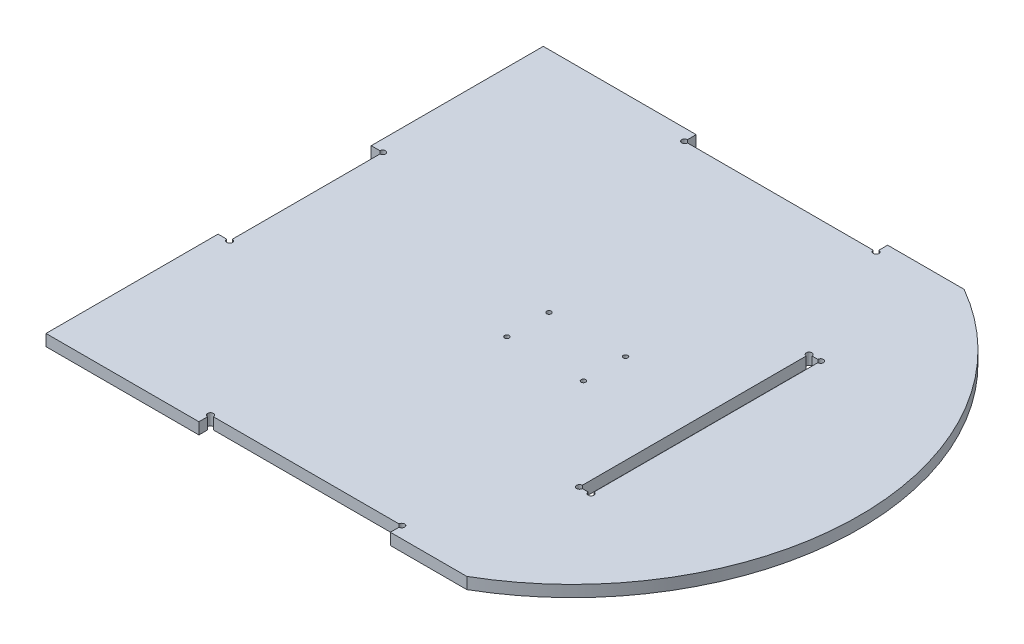
ISO-10303-21;
HEADER;
FILE_DESCRIPTION(('STEP AP214'),'2;1');
FILE_NAME('part.step','',(''),(''),'','','');
FILE_SCHEMA(('AUTOMOTIVE_DESIGN { 1 0 10303 214 1 1 1 1 }'));
ENDSEC;
DATA;
#1=APPLICATION_CONTEXT('core data for automotive mechanical design processes');
#2=APPLICATION_PROTOCOL_DEFINITION('international standard','automotive_design',2000,#1);
#3=PRODUCT_CONTEXT('',#1,'mechanical');
#4=PRODUCT('Part','Part','',(#3));
#5=PRODUCT_RELATED_PRODUCT_CATEGORY('part','',(#4));
#6=PRODUCT_DEFINITION_FORMATION('','',#4);
#7=PRODUCT_DEFINITION_CONTEXT('part definition',#1,'design');
#8=PRODUCT_DEFINITION('design','',#6,#7);
#9=PRODUCT_DEFINITION_SHAPE('','',#8);
#10=(LENGTH_UNIT() NAMED_UNIT(*) SI_UNIT(.MILLI.,.METRE.));
#11=(NAMED_UNIT(*) PLANE_ANGLE_UNIT() SI_UNIT($,.RADIAN.));
#12=(NAMED_UNIT(*) SI_UNIT($,.STERADIAN.) SOLID_ANGLE_UNIT());
#13=UNCERTAINTY_MEASURE_WITH_UNIT(LENGTH_MEASURE(1.E-05),#10,'distance_accuracy_value','');
#14=(GEOMETRIC_REPRESENTATION_CONTEXT(3) GLOBAL_UNCERTAINTY_ASSIGNED_CONTEXT((#13)) GLOBAL_UNIT_ASSIGNED_CONTEXT((#10,
#11,#12)) REPRESENTATION_CONTEXT('',''));
#15=CARTESIAN_POINT('',(0.,0.,0.));
#16=DIRECTION('',(0.,0.,1.));
#17=DIRECTION('',(1.,0.,0.));
#18=AXIS2_PLACEMENT_3D('',#15,#16,#17);
#19=CARTESIAN_POINT('',(-130.,-6.,-130.));
#20=DIRECTION('',(-1.,0.,0.));
#21=DIRECTION('',(0.,0.,1.));
#22=AXIS2_PLACEMENT_3D('',#19,#20,#21);
#23=PLANE('',#22);
#24=DIRECTION('',(0.,-1.,0.));
#25=VECTOR('',#24,1.);
#26=CARTESIAN_POINT('',(-130.,0.00100000000000013,40.05));
#27=LINE('',#26,#25);
#28=CARTESIAN_POINT('',(-130.,0.,40.05));
#29=VERTEX_POINT('',#28);
#30=CARTESIAN_POINT('',(-130.,-6.,40.05));
#31=VERTEX_POINT('',#30);
#32=EDGE_CURVE('E311',#29,#31,#27,.T.);
#33=ORIENTED_EDGE('',*,*,#32,.T.);
#34=DIRECTION('',(0.,0.,1.));
#35=VECTOR('',#34,1.);
#36=CARTESIAN_POINT('',(-130.,-6.,-130.));
#37=LINE('',#36,#35);
#38=CARTESIAN_POINT('',(-130.,-6.,130.));
#39=VERTEX_POINT('',#38);
#40=EDGE_CURVE('E357',#31,#39,#37,.T.);
#41=ORIENTED_EDGE('',*,*,#40,.T.);
#42=DIRECTION('',(0.,1.,0.));
#43=VECTOR('',#42,1.);
#44=CARTESIAN_POINT('',(-130.,-6.,130.));
#45=LINE('',#44,#43);
#46=CARTESIAN_POINT('',(-130.,0.,130.));
#47=VERTEX_POINT('',#46);
#48=EDGE_CURVE('E368',#39,#47,#45,.T.);
#49=ORIENTED_EDGE('',*,*,#48,.T.);
#50=DIRECTION('',(0.,0.,1.));
#51=VECTOR('',#50,1.);
#52=CARTESIAN_POINT('',(-130.,0.,-130.));
#53=LINE('',#52,#51);
#54=EDGE_CURVE('E352',#29,#47,#53,.T.);
#55=ORIENTED_EDGE('',*,*,#54,.F.);
#56=EDGE_LOOP('',(#33,#41,#49,#55));
#57=FACE_BOUND('',#56,.T.);
#58=ADVANCED_FACE('F33',(#57),#23,.T.);
#59=CARTESIAN_POINT('',(-130.,-6.,-130.));
#60=DIRECTION('',(0.,0.,-1.));
#61=DIRECTION('',(-1.,0.,0.));
#62=AXIS2_PLACEMENT_3D('',#59,#60,#61);
#63=PLANE('',#62);
#64=DIRECTION('',(0.,-1.,0.));
#65=VECTOR('',#64,1.);
#66=CARTESIAN_POINT('',(-50.05,0.00100000000000013,-130.));
#67=LINE('',#66,#65);
#68=CARTESIAN_POINT('',(-50.05,0.,-130.));
#69=VERTEX_POINT('',#68);
#70=CARTESIAN_POINT('',(-50.05,-6.,-130.));
#71=VERTEX_POINT('',#70);
#72=EDGE_CURVE('E268',#69,#71,#67,.T.);
#73=ORIENTED_EDGE('',*,*,#72,.T.);
#74=DIRECTION('',(-1.,0.,0.));
#75=VECTOR('',#74,1.);
#76=CARTESIAN_POINT('',(-130.,-6.,-130.));
#77=LINE('',#76,#75);
#78=CARTESIAN_POINT('',(-130.,-6.,-130.));
#79=VERTEX_POINT('',#78);
#80=EDGE_CURVE('E364',#71,#79,#77,.T.);
#81=ORIENTED_EDGE('',*,*,#80,.T.);
#82=DIRECTION('',(0.,1.,0.));
#83=VECTOR('',#82,1.);
#84=CARTESIAN_POINT('',(-130.,-6.,-130.));
#85=LINE('',#84,#83);
#86=CARTESIAN_POINT('',(-130.,0.,-130.));
#87=VERTEX_POINT('',#86);
#88=EDGE_CURVE('E383',#79,#87,#85,.T.);
#89=ORIENTED_EDGE('',*,*,#88,.T.);
#90=DIRECTION('',(-1.,0.,0.));
#91=VECTOR('',#90,1.);
#92=CARTESIAN_POINT('',(-130.,0.,-130.));
#93=LINE('',#92,#91);
#94=EDGE_CURVE('E379',#69,#87,#93,.T.);
#95=ORIENTED_EDGE('',*,*,#94,.F.);
#96=EDGE_LOOP('',(#73,#81,#89,#95));
#97=FACE_BOUND('',#96,.T.);
#98=ADVANCED_FACE('F579',(#97),#63,.T.);
#99=CARTESIAN_POINT('',(-130.,-6.,130.));
#100=DIRECTION('',(0.,0.,1.));
#101=DIRECTION('',(1.,0.,0.));
#102=AXIS2_PLACEMENT_3D('',#99,#100,#101);
#103=PLANE('',#102);
#104=DIRECTION('',(0.,1.,0.));
#105=VECTOR('',#104,1.);
#106=CARTESIAN_POINT('',(-50.05,0.00100000000000013,130.));
#107=LINE('',#106,#105);
#108=CARTESIAN_POINT('',(-50.05,-6.,130.));
#109=VERTEX_POINT('',#108);
#110=CARTESIAN_POINT('',(-50.05,0.,130.));
#111=VERTEX_POINT('',#110);
#112=EDGE_CURVE('E290',#109,#111,#107,.T.);
#113=ORIENTED_EDGE('',*,*,#112,.T.);
#114=DIRECTION('',(1.,0.,0.));
#115=VECTOR('',#114,1.);
#116=CARTESIAN_POINT('',(-130.,0.,130.));
#117=LINE('',#116,#115);
#118=EDGE_CURVE('E373',#47,#111,#117,.T.);
#119=ORIENTED_EDGE('',*,*,#118,.F.);
#120=ORIENTED_EDGE('',*,*,#48,.F.);
#121=DIRECTION('',(1.,0.,0.));
#122=VECTOR('',#121,1.);
#123=CARTESIAN_POINT('',(-130.,-6.,130.));
#124=LINE('',#123,#122);
#125=EDGE_CURVE('E358',#39,#109,#124,.T.);
#126=ORIENTED_EDGE('',*,*,#125,.T.);
#127=EDGE_LOOP('',(#113,#119,#120,#126));
#128=FACE_BOUND('',#127,.T.);
#129=ADVANCED_FACE('F552',(#128),#103,.T.);
#130=DIRECTION('',(0.,1.,0.));
#131=VECTOR('',#130,1.);
#132=CARTESIAN_POINT('',(-130.,0.00100000000000013,-40.05));
#133=LINE('',#132,#131);
#134=CARTESIAN_POINT('',(-130.,-6.,-40.05));
#135=VERTEX_POINT('',#134);
#136=CARTESIAN_POINT('',(-130.,0.,-40.05));
#137=VERTEX_POINT('',#136);
#138=EDGE_CURVE('E308',#135,#137,#133,.T.);
#139=ORIENTED_EDGE('',*,*,#138,.T.);
#140=EDGE_CURVE('E369',#87,#137,#53,.T.);
#141=ORIENTED_EDGE('',*,*,#140,.F.);
#142=ORIENTED_EDGE('',*,*,#88,.F.);
#143=EDGE_CURVE('E353',#79,#135,#37,.T.);
#144=ORIENTED_EDGE('',*,*,#143,.T.);
#145=EDGE_LOOP('',(#139,#141,#142,#144));
#146=FACE_BOUND('',#145,.T.);
#147=ADVANCED_FACE('F35',(#146),#23,.T.);
#148=DIRECTION('',(0.,1.,0.));
#149=VECTOR('',#148,1.);
#150=CARTESIAN_POINT('',(50.05,0.00100000000000013,-130.));
#151=LINE('',#150,#149);
#152=CARTESIAN_POINT('',(50.05,-6.,-130.));
#153=VERTEX_POINT('',#152);
#154=CARTESIAN_POINT('',(50.05,0.,-130.));
#155=VERTEX_POINT('',#154);
#156=EDGE_CURVE('E265',#153,#155,#151,.T.);
#157=ORIENTED_EDGE('',*,*,#156,.T.);
#158=CARTESIAN_POINT('',(90.,0.,-130.));
#159=VERTEX_POINT('',#158);
#160=EDGE_CURVE('E380',#159,#155,#93,.T.);
#161=ORIENTED_EDGE('',*,*,#160,.F.);
#162=DIRECTION('',(0.,1.,0.));
#163=VECTOR('',#162,1.);
#164=CARTESIAN_POINT('',(90.,-6.,-130.));
#165=LINE('',#164,#163);
#166=CARTESIAN_POINT('',(90.,-6.,-130.));
#167=VERTEX_POINT('',#166);
#168=EDGE_CURVE('E387',#167,#159,#165,.T.);
#169=ORIENTED_EDGE('',*,*,#168,.F.);
#170=EDGE_CURVE('E365',#167,#153,#77,.T.);
#171=ORIENTED_EDGE('',*,*,#170,.T.);
#172=EDGE_LOOP('',(#157,#161,#169,#171));
#173=FACE_BOUND('',#172,.T.);
#174=ADVANCED_FACE('F521',(#173),#63,.T.);
#175=CARTESIAN_POINT('',(15.1668522645212,-6.,0.));
#176=DIRECTION('',(0.,1.,0.));
#177=DIRECTION('',(0.,0.,1.));
#178=AXIS2_PLACEMENT_3D('',#175,#176,#177);
#179=CYLINDRICAL_SURFACE('',#178,150.);
#180=CARTESIAN_POINT('',(15.1668522645212,0.,0.));
#181=DIRECTION('',(0.,1.,0.));
#182=DIRECTION('',(0.,0.,-1.));
#183=AXIS2_PLACEMENT_3D('',#180,#181,#182);
#184=CIRCLE('',#183,150.);
#185=CARTESIAN_POINT('',(90.0000000000001,0.,130.));
#186=VERTEX_POINT('',#185);
#187=EDGE_CURVE('E376',#186,#159,#184,.T.);
#188=ORIENTED_EDGE('',*,*,#187,.F.);
#189=DIRECTION('',(0.,1.,0.));
#190=VECTOR('',#189,1.);
#191=CARTESIAN_POINT('',(90.0000000000001,-6.,130.));
#192=LINE('',#191,#190);
#193=CARTESIAN_POINT('',(90.0000000000001,-6.,130.));
#194=VERTEX_POINT('',#193);
#195=EDGE_CURVE('E389',#194,#186,#192,.T.);
#196=ORIENTED_EDGE('',*,*,#195,.F.);
#197=CARTESIAN_POINT('',(15.1668522645212,-6.,0.));
#198=DIRECTION('',(0.,1.,0.));
#199=DIRECTION('',(0.,0.,-1.));
#200=AXIS2_PLACEMENT_3D('',#197,#198,#199);
#201=CIRCLE('',#200,150.);
#202=EDGE_CURVE('E361',#194,#167,#201,.T.);
#203=ORIENTED_EDGE('',*,*,#202,.T.);
#204=ORIENTED_EDGE('',*,*,#168,.T.);
#205=EDGE_LOOP('',(#188,#196,#203,#204));
#206=FACE_BOUND('',#205,.T.);
#207=ADVANCED_FACE('F526',(#206),#179,.T.);
#208=DIRECTION('',(0.,-1.,0.));
#209=VECTOR('',#208,1.);
#210=CARTESIAN_POINT('',(50.05,0.00100000000000013,130.));
#211=LINE('',#210,#209);
#212=CARTESIAN_POINT('',(50.05,0.,130.));
#213=VERTEX_POINT('',#212);
#214=CARTESIAN_POINT('',(50.05,-6.,130.));
#215=VERTEX_POINT('',#214);
#216=EDGE_CURVE('E287',#213,#215,#211,.T.);
#217=ORIENTED_EDGE('',*,*,#216,.T.);
#218=EDGE_CURVE('E356',#215,#194,#124,.T.);
#219=ORIENTED_EDGE('',*,*,#218,.T.);
#220=ORIENTED_EDGE('',*,*,#195,.T.);
#221=EDGE_CURVE('E372',#213,#186,#117,.T.);
#222=ORIENTED_EDGE('',*,*,#221,.F.);
#223=EDGE_LOOP('',(#217,#219,#220,#222));
#224=FACE_BOUND('',#223,.T.);
#225=ADVANCED_FACE('F531',(#224),#103,.T.);
#226=CARTESIAN_POINT('',(15.1668522645212,-6.,0.));
#227=DIRECTION('',(0.,-1.,0.));
#228=DIRECTION('',(0.,0.,-1.));
#229=AXIS2_PLACEMENT_3D('',#226,#227,#228);
#230=PLANE('',#229);
#231=CARTESIAN_POINT('',(85.,-6.,-60.));
#232=DIRECTION('',(0.,-1.,0.));
#233=DIRECTION('',(0.,0.,-1.));
#234=AXIS2_PLACEMENT_3D('',#231,#232,#233);
#235=CIRCLE('',#234,1.5);
#236=CARTESIAN_POINT('',(83.5008335649435,-6.,-60.05));
#237=VERTEX_POINT('',#236);
#238=CARTESIAN_POINT('',(85.05,-6.,-58.5008335649435));
#239=VERTEX_POINT('',#238);
#240=EDGE_CURVE('E240',#237,#239,#235,.T.);
#241=ORIENTED_EDGE('',*,*,#240,.F.);
#242=DIRECTION('',(1.,0.,0.));
#243=VECTOR('',#242,1.);
#244=CARTESIAN_POINT('',(78.95,-6.,-60.05));
#245=LINE('',#244,#243);
#246=CARTESIAN_POINT('',(80.4991664350565,-6.,-60.05));
#247=VERTEX_POINT('',#246);
#248=EDGE_CURVE('E238',#247,#237,#245,.T.);
#249=ORIENTED_EDGE('',*,*,#248,.F.);
#250=CARTESIAN_POINT('',(79.,-6.,-60.));
#251=DIRECTION('',(0.,-1.,0.));
#252=DIRECTION('',(0.,0.,-1.));
#253=AXIS2_PLACEMENT_3D('',#250,#251,#252);
#254=CIRCLE('',#253,1.5);
#255=CARTESIAN_POINT('',(78.95,-6.,-58.5008335649435));
#256=VERTEX_POINT('',#255);
#257=EDGE_CURVE('E420',#256,#247,#254,.T.);
#258=ORIENTED_EDGE('',*,*,#257,.F.);
#259=DIRECTION('',(0.,0.,-1.));
#260=VECTOR('',#259,1.);
#261=CARTESIAN_POINT('',(78.95,-6.,60.05));
#262=LINE('',#261,#260);
#263=CARTESIAN_POINT('',(78.95,-6.,58.55));
#264=VERTEX_POINT('',#263);
#265=EDGE_CURVE('E259',#264,#256,#262,.T.);
#266=ORIENTED_EDGE('',*,*,#265,.F.);
#267=CARTESIAN_POINT('',(78.95,-6.,60.05));
#268=DIRECTION('',(0.,-1.,0.));
#269=DIRECTION('',(0.,0.,-1.));
#270=AXIS2_PLACEMENT_3D('',#267,#268,#269);
#271=CIRCLE('',#270,1.5);
#272=CARTESIAN_POINT('',(80.45,-6.,60.05));
#273=VERTEX_POINT('',#272);
#274=EDGE_CURVE('E239',#273,#264,#271,.T.);
#275=ORIENTED_EDGE('',*,*,#274,.F.);
#276=DIRECTION('',(-1.,0.,0.));
#277=VECTOR('',#276,1.);
#278=CARTESIAN_POINT('',(85.05,-6.,60.05));
#279=LINE('',#278,#277);
#280=CARTESIAN_POINT('',(83.5008335649435,-6.,60.05));
#281=VERTEX_POINT('',#280);
#282=EDGE_CURVE('E256',#281,#273,#279,.T.);
#283=ORIENTED_EDGE('',*,*,#282,.F.);
#284=CARTESIAN_POINT('',(85.,-6.,60.));
#285=DIRECTION('',(0.,-1.,0.));
#286=DIRECTION('',(0.,0.,-1.));
#287=AXIS2_PLACEMENT_3D('',#284,#285,#286);
#288=CIRCLE('',#287,1.5);
#289=CARTESIAN_POINT('',(85.05,-6.,58.5008335649435));
#290=VERTEX_POINT('',#289);
#291=EDGE_CURVE('E442',#290,#281,#288,.T.);
#292=ORIENTED_EDGE('',*,*,#291,.F.);
#293=DIRECTION('',(0.,0.,1.));
#294=VECTOR('',#293,1.);
#295=CARTESIAN_POINT('',(85.05,-6.,-60.05));
#296=LINE('',#295,#294);
#297=EDGE_CURVE('E249',#239,#290,#296,.T.);
#298=ORIENTED_EDGE('',*,*,#297,.F.);
#299=EDGE_LOOP('',(#241,#249,#258,#266,#275,#283,#292,#298));
#300=FACE_BOUND('',#299,.T.);
#301=CARTESIAN_POINT('',(-124.,-6.,-40.));
#302=DIRECTION('',(0.,-1.,0.));
#303=DIRECTION('',(0.,0.,-1.));
#304=AXIS2_PLACEMENT_3D('',#301,#302,#303);
#305=CIRCLE('',#304,1.5);
#306=CARTESIAN_POINT('',(-125.499166435057,-6.,-40.05));
#307=VERTEX_POINT('',#306);
#308=CARTESIAN_POINT('',(-123.95,-6.,-38.5008335649435));
#309=VERTEX_POINT('',#308);
#310=EDGE_CURVE('E450',#307,#309,#305,.T.);
#311=ORIENTED_EDGE('',*,*,#310,.F.);
#312=DIRECTION('',(1.,0.,0.));
#313=VECTOR('',#312,1.);
#314=CARTESIAN_POINT('',(-130.05,-6.,-40.05));
#315=LINE('',#314,#313);
#316=EDGE_CURVE('E323',#135,#307,#315,.T.);
#317=ORIENTED_EDGE('',*,*,#316,.F.);
#318=ORIENTED_EDGE('',*,*,#143,.F.);
#319=ORIENTED_EDGE('',*,*,#80,.F.);
#320=DIRECTION('',(0.,0.,-1.));
#321=VECTOR('',#320,1.);
#322=CARTESIAN_POINT('',(-50.05,-6.,-123.95));
#323=LINE('',#322,#321);
#324=CARTESIAN_POINT('',(-50.05,-6.,-125.45));
#325=VERTEX_POINT('',#324);
#326=EDGE_CURVE('E278',#325,#71,#323,.T.);
#327=ORIENTED_EDGE('',*,*,#326,.F.);
#328=CARTESIAN_POINT('',(-50.05,-6.,-123.95));
#329=DIRECTION('',(0.,-1.,0.));
#330=DIRECTION('',(0.,0.,-1.));
#331=AXIS2_PLACEMENT_3D('',#328,#329,#330);
#332=CIRCLE('',#331,1.5);
#333=CARTESIAN_POINT('',(-48.55,-6.,-123.95));
#334=VERTEX_POINT('',#333);
#335=EDGE_CURVE('E491',#334,#325,#332,.T.);
#336=ORIENTED_EDGE('',*,*,#335,.F.);
#337=DIRECTION('',(-1.,0.,0.));
#338=VECTOR('',#337,1.);
#339=CARTESIAN_POINT('',(50.05,-6.,-123.95));
#340=LINE('',#339,#338);
#341=CARTESIAN_POINT('',(48.55,-6.,-123.95));
#342=VERTEX_POINT('',#341);
#343=EDGE_CURVE('E283',#342,#334,#340,.T.);
#344=ORIENTED_EDGE('',*,*,#343,.F.);
#345=CARTESIAN_POINT('',(50.05,-6.,-123.95));
#346=DIRECTION('',(0.,-1.,0.));
#347=DIRECTION('',(0.,0.,-1.));
#348=AXIS2_PLACEMENT_3D('',#345,#346,#347);
#349=CIRCLE('',#348,1.5);
#350=CARTESIAN_POINT('',(50.05,-6.,-125.45));
#351=VERTEX_POINT('',#350);
#352=EDGE_CURVE('E483',#351,#342,#349,.T.);
#353=ORIENTED_EDGE('',*,*,#352,.F.);
#354=DIRECTION('',(0.,0.,1.));
#355=VECTOR('',#354,1.);
#356=CARTESIAN_POINT('',(50.05,-6.,-130.05));
#357=LINE('',#356,#355);
#358=EDGE_CURVE('E280',#153,#351,#357,.T.);
#359=ORIENTED_EDGE('',*,*,#358,.F.);
#360=ORIENTED_EDGE('',*,*,#170,.F.);
#361=ORIENTED_EDGE('',*,*,#202,.F.);
#362=ORIENTED_EDGE('',*,*,#218,.F.);
#363=DIRECTION('',(0.,0.,1.));
#364=VECTOR('',#363,1.);
#365=CARTESIAN_POINT('',(50.05,-6.,123.95));
#366=LINE('',#365,#364);
#367=CARTESIAN_POINT('',(50.05,-6.,125.499166435056));
#368=VERTEX_POINT('',#367);
#369=EDGE_CURVE('E304',#368,#215,#366,.T.);
#370=ORIENTED_EDGE('',*,*,#369,.F.);
#371=CARTESIAN_POINT('',(50.,-6.,124.));
#372=DIRECTION('',(0.,-1.,0.));
#373=DIRECTION('',(0.,0.,-1.));
#374=AXIS2_PLACEMENT_3D('',#371,#372,#373);
#375=CIRCLE('',#374,1.5);
#376=CARTESIAN_POINT('',(48.5008335649435,-6.,123.95));
#377=VERTEX_POINT('',#376);
#378=EDGE_CURVE('E473',#377,#368,#375,.T.);
#379=ORIENTED_EDGE('',*,*,#378,.F.);
#380=DIRECTION('',(1.,0.,0.));
#381=VECTOR('',#380,1.);
#382=CARTESIAN_POINT('',(-50.05,-6.,123.95));
#383=LINE('',#382,#381);
#384=CARTESIAN_POINT('',(-48.55,-6.,123.95));
#385=VERTEX_POINT('',#384);
#386=EDGE_CURVE('E302',#385,#377,#383,.T.);
#387=ORIENTED_EDGE('',*,*,#386,.F.);
#388=CARTESIAN_POINT('',(-50.05,-6.,123.95));
#389=DIRECTION('',(0.,-1.,0.));
#390=DIRECTION('',(0.,0.,-1.));
#391=AXIS2_PLACEMENT_3D('',#388,#389,#390);
#392=CIRCLE('',#391,1.5);
#393=CARTESIAN_POINT('',(-50.05,-6.,125.45));
#394=VERTEX_POINT('',#393);
#395=EDGE_CURVE('E465',#394,#385,#392,.T.);
#396=ORIENTED_EDGE('',*,*,#395,.F.);
#397=DIRECTION('',(0.,0.,-1.));
#398=VECTOR('',#397,1.);
#399=CARTESIAN_POINT('',(-50.05,-6.,130.05));
#400=LINE('',#399,#398);
#401=EDGE_CURVE('E299',#109,#394,#400,.T.);
#402=ORIENTED_EDGE('',*,*,#401,.F.);
#403=ORIENTED_EDGE('',*,*,#125,.F.);
#404=ORIENTED_EDGE('',*,*,#40,.F.);
#405=DIRECTION('',(-1.,0.,0.));
#406=VECTOR('',#405,1.);
#407=CARTESIAN_POINT('',(-123.95,-6.,40.05));
#408=LINE('',#407,#406);
#409=CARTESIAN_POINT('',(-125.45,-6.,40.05));
#410=VERTEX_POINT('',#409);
#411=EDGE_CURVE('E321',#410,#31,#408,.T.);
#412=ORIENTED_EDGE('',*,*,#411,.F.);
#413=CARTESIAN_POINT('',(-123.95,-6.,40.05));
#414=DIRECTION('',(0.,-1.,0.));
#415=DIRECTION('',(0.,0.,-1.));
#416=AXIS2_PLACEMENT_3D('',#413,#414,#415);
#417=CIRCLE('',#416,1.5);
#418=CARTESIAN_POINT('',(-123.95,-6.,38.55));
#419=VERTEX_POINT('',#418);
#420=EDGE_CURVE('E457',#419,#410,#417,.T.);
#421=ORIENTED_EDGE('',*,*,#420,.F.);
#422=DIRECTION('',(0.,0.,1.));
#423=VECTOR('',#422,1.);
#424=CARTESIAN_POINT('',(-123.95,-6.,-40.05));
#425=LINE('',#424,#423);
#426=EDGE_CURVE('E326',#309,#419,#425,.T.);
#427=ORIENTED_EDGE('',*,*,#426,.F.);
#428=EDGE_LOOP('',(#311,#317,#318,#319,#327,#336,#344,#353,#359,#360,#361,#362,#370,#379,#387,
#396,#402,#403,#404,#412,#421,#427));
#429=FACE_BOUND('',#428,.T.);
#430=CARTESIAN_POINT('',(32.,-6.,11.));
#431=DIRECTION('',(0.,-1.,0.));
#432=DIRECTION('',(0.,0.,-1.));
#433=AXIS2_PLACEMENT_3D('',#430,#431,#432);
#434=CIRCLE('',#433,1.2);
#435=CARTESIAN_POINT('',(32.,-6.,9.8));
#436=VERTEX_POINT('',#435);
#437=EDGE_CURVE('E264',#436,#436,#434,.T.);
#438=ORIENTED_EDGE('',*,*,#437,.F.);
#439=EDGE_LOOP('',(#438));
#440=FACE_BOUND('',#439,.T.);
#441=CARTESIAN_POINT('',(32.,-6.,-11.));
#442=DIRECTION('',(0.,-1.,0.));
#443=DIRECTION('',(0.,0.,-1.));
#444=AXIS2_PLACEMENT_3D('',#441,#442,#443);
#445=CIRCLE('',#444,1.2);
#446=CARTESIAN_POINT('',(32.,-6.,-12.2));
#447=VERTEX_POINT('',#446);
#448=EDGE_CURVE('E334',#447,#447,#445,.T.);
#449=ORIENTED_EDGE('',*,*,#448,.F.);
#450=EDGE_LOOP('',(#449));
#451=FACE_BOUND('',#450,.T.);
#452=CARTESIAN_POINT('',(-8.,-6.,11.));
#453=DIRECTION('',(0.,-1.,0.));
#454=DIRECTION('',(0.,0.,-1.));
#455=AXIS2_PLACEMENT_3D('',#452,#453,#454);
#456=CIRCLE('',#455,1.2);
#457=CARTESIAN_POINT('',(-8.,-6.,9.8));
#458=VERTEX_POINT('',#457);
#459=EDGE_CURVE('E340',#458,#458,#456,.T.);
#460=ORIENTED_EDGE('',*,*,#459,.F.);
#461=EDGE_LOOP('',(#460));
#462=FACE_BOUND('',#461,.T.);
#463=CARTESIAN_POINT('',(-8.,-6.,-11.));
#464=DIRECTION('',(0.,-1.,0.));
#465=DIRECTION('',(0.,0.,-1.));
#466=AXIS2_PLACEMENT_3D('',#463,#464,#465);
#467=CIRCLE('',#466,1.2);
#468=CARTESIAN_POINT('',(-8.,-6.,-12.2));
#469=VERTEX_POINT('',#468);
#470=EDGE_CURVE('E346',#469,#469,#467,.T.);
#471=ORIENTED_EDGE('',*,*,#470,.F.);
#472=EDGE_LOOP('',(#471));
#473=FACE_BOUND('',#472,.T.);
#474=ADVANCED_FACE('F517',(#300,#429,#440,#451,#462,#473),#230,.T.);
#475=CARTESIAN_POINT('',(15.1668522645212,0.,0.));
#476=DIRECTION('',(0.,-1.,0.));
#477=DIRECTION('',(0.,0.,-1.));
#478=AXIS2_PLACEMENT_3D('',#475,#476,#477);
#479=PLANE('',#478);
#480=DIRECTION('',(-1.,0.,0.));
#481=VECTOR('',#480,1.);
#482=CARTESIAN_POINT('',(78.95,0.,-60.05));
#483=LINE('',#482,#481);
#484=CARTESIAN_POINT('',(83.5008335649435,0.,-60.05));
#485=VERTEX_POINT('',#484);
#486=CARTESIAN_POINT('',(80.4991664350565,0.,-60.05));
#487=VERTEX_POINT('',#486);
#488=EDGE_CURVE('E54',#485,#487,#483,.T.);
#489=ORIENTED_EDGE('',*,*,#488,.F.);
#490=CARTESIAN_POINT('',(85.,0.,-60.));
#491=DIRECTION('',(0.,-1.,0.));
#492=DIRECTION('',(0.,0.,-1.));
#493=AXIS2_PLACEMENT_3D('',#490,#491,#492);
#494=CIRCLE('',#493,1.5);
#495=CARTESIAN_POINT('',(85.05,0.,-58.5008335649435));
#496=VERTEX_POINT('',#495);
#497=EDGE_CURVE('E41',#485,#496,#494,.T.);
#498=ORIENTED_EDGE('',*,*,#497,.T.);
#499=DIRECTION('',(0.,0.,-1.));
#500=VECTOR('',#499,1.);
#501=CARTESIAN_POINT('',(85.05,0.,-60.05));
#502=LINE('',#501,#500);
#503=CARTESIAN_POINT('',(85.05,0.,58.5008335649435));
#504=VERTEX_POINT('',#503);
#505=EDGE_CURVE('E262',#504,#496,#502,.T.);
#506=ORIENTED_EDGE('',*,*,#505,.F.);
#507=CARTESIAN_POINT('',(85.,0.,60.));
#508=DIRECTION('',(0.,-1.,0.));
#509=DIRECTION('',(0.,0.,-1.));
#510=AXIS2_PLACEMENT_3D('',#507,#508,#509);
#511=CIRCLE('',#510,1.5);
#512=CARTESIAN_POINT('',(83.5008335649435,0.,60.05));
#513=VERTEX_POINT('',#512);
#514=EDGE_CURVE('E448',#504,#513,#511,.T.);
#515=ORIENTED_EDGE('',*,*,#514,.T.);
#516=DIRECTION('',(1.,0.,0.));
#517=VECTOR('',#516,1.);
#518=CARTESIAN_POINT('',(85.05,0.,60.05));
#519=LINE('',#518,#517);
#520=CARTESIAN_POINT('',(80.45,0.,60.05));
#521=VERTEX_POINT('',#520);
#522=EDGE_CURVE('E251',#521,#513,#519,.T.);
#523=ORIENTED_EDGE('',*,*,#522,.F.);
#524=CARTESIAN_POINT('',(78.95,0.,60.05));
#525=DIRECTION('',(0.,-1.,0.));
#526=DIRECTION('',(0.,0.,-1.));
#527=AXIS2_PLACEMENT_3D('',#524,#525,#526);
#528=CIRCLE('',#527,1.5);
#529=CARTESIAN_POINT('',(78.95,0.,58.55));
#530=VERTEX_POINT('',#529);
#531=EDGE_CURVE('E416',#521,#530,#528,.T.);
#532=ORIENTED_EDGE('',*,*,#531,.T.);
#533=DIRECTION('',(0.,0.,1.));
#534=VECTOR('',#533,1.);
#535=CARTESIAN_POINT('',(78.95,0.,60.05));
#536=LINE('',#535,#534);
#537=CARTESIAN_POINT('',(78.95,0.,-58.5008335649435));
#538=VERTEX_POINT('',#537);
#539=EDGE_CURVE('E247',#538,#530,#536,.T.);
#540=ORIENTED_EDGE('',*,*,#539,.F.);
#541=CARTESIAN_POINT('',(79.,0.,-60.));
#542=DIRECTION('',(0.,-1.,0.));
#543=DIRECTION('',(0.,0.,-1.));
#544=AXIS2_PLACEMENT_3D('',#541,#542,#543);
#545=CIRCLE('',#544,1.5);
#546=EDGE_CURVE('E246',#538,#487,#545,.T.);
#547=ORIENTED_EDGE('',*,*,#546,.T.);
#548=EDGE_LOOP('',(#489,#498,#506,#515,#523,#532,#540,#547));
#549=FACE_BOUND('',#548,.T.);
#550=CARTESIAN_POINT('',(32.,0.,11.));
#551=DIRECTION('',(0.,-1.,0.));
#552=DIRECTION('',(0.,0.,-1.));
#553=AXIS2_PLACEMENT_3D('',#550,#551,#552);
#554=CIRCLE('',#553,1.2);
#555=CARTESIAN_POINT('',(32.,0.,9.8));
#556=VERTEX_POINT('',#555);
#557=EDGE_CURVE('E331',#556,#556,#554,.T.);
#558=ORIENTED_EDGE('',*,*,#557,.T.);
#559=EDGE_LOOP('',(#558));
#560=FACE_BOUND('',#559,.T.);
#561=CARTESIAN_POINT('',(32.,0.,-11.));
#562=DIRECTION('',(0.,-1.,0.));
#563=DIRECTION('',(0.,0.,-1.));
#564=AXIS2_PLACEMENT_3D('',#561,#562,#563);
#565=CIRCLE('',#564,1.2);
#566=CARTESIAN_POINT('',(32.,0.,-12.2));
#567=VERTEX_POINT('',#566);
#568=EDGE_CURVE('E337',#567,#567,#565,.T.);
#569=ORIENTED_EDGE('',*,*,#568,.T.);
#570=EDGE_LOOP('',(#569));
#571=FACE_BOUND('',#570,.T.);
#572=CARTESIAN_POINT('',(-8.,0.,11.));
#573=DIRECTION('',(0.,-1.,0.));
#574=DIRECTION('',(0.,0.,-1.));
#575=AXIS2_PLACEMENT_3D('',#572,#573,#574);
#576=CIRCLE('',#575,1.2);
#577=CARTESIAN_POINT('',(-8.,0.,9.8));
#578=VERTEX_POINT('',#577);
#579=EDGE_CURVE('E343',#578,#578,#576,.T.);
#580=ORIENTED_EDGE('',*,*,#579,.T.);
#581=EDGE_LOOP('',(#580));
#582=FACE_BOUND('',#581,.T.);
#583=CARTESIAN_POINT('',(-8.,0.,-11.));
#584=DIRECTION('',(0.,-1.,0.));
#585=DIRECTION('',(0.,0.,-1.));
#586=AXIS2_PLACEMENT_3D('',#583,#584,#585);
#587=CIRCLE('',#586,1.2);
#588=CARTESIAN_POINT('',(-8.,0.,-12.2));
#589=VERTEX_POINT('',#588);
#590=EDGE_CURVE('E349',#589,#589,#587,.T.);
#591=ORIENTED_EDGE('',*,*,#590,.T.);
#592=EDGE_LOOP('',(#591));
#593=FACE_BOUND('',#592,.T.);
#594=DIRECTION('',(-1.,0.,0.));
#595=VECTOR('',#594,1.);
#596=CARTESIAN_POINT('',(-130.05,0.,-40.05));
#597=LINE('',#596,#595);
#598=CARTESIAN_POINT('',(-125.499166435057,0.,-40.05));
#599=VERTEX_POINT('',#598);
#600=EDGE_CURVE('E291',#599,#137,#597,.T.);
#601=ORIENTED_EDGE('',*,*,#600,.F.);
#602=CARTESIAN_POINT('',(-124.,0.,-40.));
#603=DIRECTION('',(0.,-1.,0.));
#604=DIRECTION('',(0.,0.,-1.));
#605=AXIS2_PLACEMENT_3D('',#602,#603,#604);
#606=CIRCLE('',#605,1.5);
#607=CARTESIAN_POINT('',(-123.95,0.,-38.5008335649435));
#608=VERTEX_POINT('',#607);
#609=EDGE_CURVE('E406',#599,#608,#606,.T.);
#610=ORIENTED_EDGE('',*,*,#609,.T.);
#611=DIRECTION('',(0.,0.,-1.));
#612=VECTOR('',#611,1.);
#613=CARTESIAN_POINT('',(-123.95,0.,-40.05));
#614=LINE('',#613,#612);
#615=CARTESIAN_POINT('',(-123.95,0.,38.55));
#616=VERTEX_POINT('',#615);
#617=EDGE_CURVE('E315',#616,#608,#614,.T.);
#618=ORIENTED_EDGE('',*,*,#617,.F.);
#619=CARTESIAN_POINT('',(-123.95,0.,40.05));
#620=DIRECTION('',(0.,-1.,0.));
#621=DIRECTION('',(0.,0.,-1.));
#622=AXIS2_PLACEMENT_3D('',#619,#620,#621);
#623=CIRCLE('',#622,1.5);
#624=CARTESIAN_POINT('',(-125.45,0.,40.05));
#625=VERTEX_POINT('',#624);
#626=EDGE_CURVE('E403',#616,#625,#623,.T.);
#627=ORIENTED_EDGE('',*,*,#626,.T.);
#628=DIRECTION('',(1.,0.,0.));
#629=VECTOR('',#628,1.);
#630=CARTESIAN_POINT('',(-123.95,0.,40.05));
#631=LINE('',#630,#629);
#632=EDGE_CURVE('E318',#29,#625,#631,.T.);
#633=ORIENTED_EDGE('',*,*,#632,.F.);
#634=ORIENTED_EDGE('',*,*,#54,.T.);
#635=ORIENTED_EDGE('',*,*,#118,.T.);
#636=DIRECTION('',(0.,0.,1.));
#637=VECTOR('',#636,1.);
#638=CARTESIAN_POINT('',(-50.05,0.,130.05));
#639=LINE('',#638,#637);
#640=CARTESIAN_POINT('',(-50.05,0.,125.45));
#641=VERTEX_POINT('',#640);
#642=EDGE_CURVE('E297',#641,#111,#639,.T.);
#643=ORIENTED_EDGE('',*,*,#642,.F.);
#644=CARTESIAN_POINT('',(-50.05,0.,123.95));
#645=DIRECTION('',(0.,-1.,0.));
#646=DIRECTION('',(0.,0.,-1.));
#647=AXIS2_PLACEMENT_3D('',#644,#645,#646);
#648=CIRCLE('',#647,1.5);
#649=CARTESIAN_POINT('',(-48.55,0.,123.95));
#650=VERTEX_POINT('',#649);
#651=EDGE_CURVE('E400',#641,#650,#648,.T.);
#652=ORIENTED_EDGE('',*,*,#651,.T.);
#653=DIRECTION('',(-1.,0.,0.));
#654=VECTOR('',#653,1.);
#655=CARTESIAN_POINT('',(-50.05,0.,123.95));
#656=LINE('',#655,#654);
#657=CARTESIAN_POINT('',(48.5008335649435,0.,123.95));
#658=VERTEX_POINT('',#657);
#659=EDGE_CURVE('E269',#658,#650,#656,.T.);
#660=ORIENTED_EDGE('',*,*,#659,.F.);
#661=CARTESIAN_POINT('',(50.,0.,124.));
#662=DIRECTION('',(0.,-1.,0.));
#663=DIRECTION('',(0.,0.,-1.));
#664=AXIS2_PLACEMENT_3D('',#661,#662,#663);
#665=CIRCLE('',#664,1.5);
#666=CARTESIAN_POINT('',(50.05,0.,125.499166435056));
#667=VERTEX_POINT('',#666);
#668=EDGE_CURVE('E399',#658,#667,#665,.T.);
#669=ORIENTED_EDGE('',*,*,#668,.T.);
#670=DIRECTION('',(0.,0.,-1.));
#671=VECTOR('',#670,1.);
#672=CARTESIAN_POINT('',(50.05,0.,123.95));
#673=LINE('',#672,#671);
#674=EDGE_CURVE('E294',#213,#667,#673,.T.);
#675=ORIENTED_EDGE('',*,*,#674,.F.);
#676=ORIENTED_EDGE('',*,*,#221,.T.);
#677=ORIENTED_EDGE('',*,*,#187,.T.);
#678=ORIENTED_EDGE('',*,*,#160,.T.);
#679=DIRECTION('',(0.,0.,-1.));
#680=VECTOR('',#679,1.);
#681=CARTESIAN_POINT('',(50.05,0.,-130.05));
#682=LINE('',#681,#680);
#683=CARTESIAN_POINT('',(50.05,0.,-125.45));
#684=VERTEX_POINT('',#683);
#685=EDGE_CURVE('E285',#684,#155,#682,.T.);
#686=ORIENTED_EDGE('',*,*,#685,.F.);
#687=CARTESIAN_POINT('',(50.05,0.,-123.95));
#688=DIRECTION('',(0.,-1.,0.));
#689=DIRECTION('',(0.,0.,-1.));
#690=AXIS2_PLACEMENT_3D('',#687,#688,#689);
#691=CIRCLE('',#690,1.5);
#692=CARTESIAN_POINT('',(48.55,0.,-123.95));
#693=VERTEX_POINT('',#692);
#694=EDGE_CURVE('E396',#684,#693,#691,.T.);
#695=ORIENTED_EDGE('',*,*,#694,.T.);
#696=DIRECTION('',(1.,0.,0.));
#697=VECTOR('',#696,1.);
#698=CARTESIAN_POINT('',(50.05,0.,-123.95));
#699=LINE('',#698,#697);
#700=CARTESIAN_POINT('',(-48.55,0.,-123.95));
#701=VERTEX_POINT('',#700);
#702=EDGE_CURVE('E272',#701,#693,#699,.T.);
#703=ORIENTED_EDGE('',*,*,#702,.F.);
#704=CARTESIAN_POINT('',(-50.05,0.,-123.95));
#705=DIRECTION('',(0.,-1.,0.));
#706=DIRECTION('',(0.,0.,-1.));
#707=AXIS2_PLACEMENT_3D('',#704,#705,#706);
#708=CIRCLE('',#707,1.5);
#709=CARTESIAN_POINT('',(-50.05,0.,-125.45));
#710=VERTEX_POINT('',#709);
#711=EDGE_CURVE('E386',#701,#710,#708,.T.);
#712=ORIENTED_EDGE('',*,*,#711,.T.);
#713=DIRECTION('',(0.,0.,1.));
#714=VECTOR('',#713,1.);
#715=CARTESIAN_POINT('',(-50.05,0.,-123.95));
#716=LINE('',#715,#714);
#717=EDGE_CURVE('E275',#69,#710,#716,.T.);
#718=ORIENTED_EDGE('',*,*,#717,.F.);
#719=ORIENTED_EDGE('',*,*,#94,.T.);
#720=ORIENTED_EDGE('',*,*,#140,.T.);
#721=EDGE_LOOP('',(#601,#610,#618,#627,#633,#634,#635,#643,#652,#660,#669,#675,#676,#677,#678,
#686,#695,#703,#712,#718,#719,#720));
#722=FACE_BOUND('',#721,.T.);
#723=ADVANCED_FACE('F243',(#549,#560,#571,#582,#593,#722),#479,.F.);
#724=CARTESIAN_POINT('',(-8.,-6.,-11.));
#725=DIRECTION('',(0.,-1.,0.));
#726=DIRECTION('',(0.,0.,-1.));
#727=AXIS2_PLACEMENT_3D('',#724,#725,#726);
#728=CYLINDRICAL_SURFACE('',#727,1.2);
#729=ORIENTED_EDGE('',*,*,#590,.F.);
#730=EDGE_LOOP('',(#729));
#731=FACE_BOUND('',#730,.T.);
#732=ORIENTED_EDGE('',*,*,#470,.T.);
#733=EDGE_LOOP('',(#732));
#734=FACE_BOUND('',#733,.T.);
#735=ADVANCED_FACE('F620',(#731,#734),#728,.F.);
#736=CARTESIAN_POINT('',(-8.,-6.,11.));
#737=DIRECTION('',(0.,-1.,0.));
#738=DIRECTION('',(0.,0.,-1.));
#739=AXIS2_PLACEMENT_3D('',#736,#737,#738);
#740=CYLINDRICAL_SURFACE('',#739,1.2);
#741=ORIENTED_EDGE('',*,*,#579,.F.);
#742=EDGE_LOOP('',(#741));
#743=FACE_BOUND('',#742,.T.);
#744=ORIENTED_EDGE('',*,*,#459,.T.);
#745=EDGE_LOOP('',(#744));
#746=FACE_BOUND('',#745,.T.);
#747=ADVANCED_FACE('F624',(#743,#746),#740,.F.);
#748=CARTESIAN_POINT('',(32.,-6.,-11.));
#749=DIRECTION('',(0.,-1.,0.));
#750=DIRECTION('',(0.,0.,-1.));
#751=AXIS2_PLACEMENT_3D('',#748,#749,#750);
#752=CYLINDRICAL_SURFACE('',#751,1.2);
#753=ORIENTED_EDGE('',*,*,#568,.F.);
#754=EDGE_LOOP('',(#753));
#755=FACE_BOUND('',#754,.T.);
#756=ORIENTED_EDGE('',*,*,#448,.T.);
#757=EDGE_LOOP('',(#756));
#758=FACE_BOUND('',#757,.T.);
#759=ADVANCED_FACE('F628',(#755,#758),#752,.F.);
#760=CARTESIAN_POINT('',(32.,-6.,11.));
#761=DIRECTION('',(0.,-1.,0.));
#762=DIRECTION('',(0.,0.,-1.));
#763=AXIS2_PLACEMENT_3D('',#760,#761,#762);
#764=CYLINDRICAL_SURFACE('',#763,1.2);
#765=ORIENTED_EDGE('',*,*,#557,.F.);
#766=EDGE_LOOP('',(#765));
#767=FACE_BOUND('',#766,.T.);
#768=ORIENTED_EDGE('',*,*,#437,.T.);
#769=EDGE_LOOP('',(#768));
#770=FACE_BOUND('',#769,.T.);
#771=ADVANCED_FACE('F632',(#767,#770),#764,.F.);
#772=CARTESIAN_POINT('',(-123.95,0.00100000000000013,-40.05));
#773=DIRECTION('',(1.,0.,0.));
#774=DIRECTION('',(0.,0.,-1.));
#775=AXIS2_PLACEMENT_3D('',#772,#773,#774);
#776=PLANE('',#775);
#777=ORIENTED_EDGE('',*,*,#617,.T.);
#778=DIRECTION('',(0.,-1.,0.));
#779=VECTOR('',#778,1.);
#780=CARTESIAN_POINT('',(-123.95,-6.,-38.5008335649435));
#781=LINE('',#780,#779);
#782=EDGE_CURVE('E452',#608,#309,#781,.T.);
#783=ORIENTED_EDGE('',*,*,#782,.T.);
#784=ORIENTED_EDGE('',*,*,#426,.T.);
#785=DIRECTION('',(0.,-1.,0.));
#786=VECTOR('',#785,1.);
#787=CARTESIAN_POINT('',(-123.95,-6.,38.55));
#788=LINE('',#787,#786);
#789=EDGE_CURVE('E459',#419,#616,#788,.F.);
#790=ORIENTED_EDGE('',*,*,#789,.T.);
#791=EDGE_LOOP('',(#777,#783,#784,#790));
#792=FACE_BOUND('',#791,.T.);
#793=ADVANCED_FACE('F568',(#792),#776,.F.);
#794=CARTESIAN_POINT('',(-123.95,0.00100000000000013,40.05));
#795=DIRECTION('',(0.,0.,1.));
#796=DIRECTION('',(1.,0.,0.));
#797=AXIS2_PLACEMENT_3D('',#794,#795,#796);
#798=PLANE('',#797);
#799=ORIENTED_EDGE('',*,*,#632,.T.);
#800=DIRECTION('',(0.,-1.,0.));
#801=VECTOR('',#800,1.);
#802=CARTESIAN_POINT('',(-125.45,-6.,40.05));
#803=LINE('',#802,#801);
#804=EDGE_CURVE('E462',#625,#410,#803,.T.);
#805=ORIENTED_EDGE('',*,*,#804,.T.);
#806=ORIENTED_EDGE('',*,*,#411,.T.);
#807=ORIENTED_EDGE('',*,*,#32,.F.);
#808=EDGE_LOOP('',(#799,#805,#806,#807));
#809=FACE_BOUND('',#808,.T.);
#810=ADVANCED_FACE('F562',(#809),#798,.F.);
#811=CARTESIAN_POINT('',(-130.05,0.00100000000000013,-40.05));
#812=DIRECTION('',(0.,0.,-1.));
#813=DIRECTION('',(-1.,0.,0.));
#814=AXIS2_PLACEMENT_3D('',#811,#812,#813);
#815=PLANE('',#814);
#816=ORIENTED_EDGE('',*,*,#316,.T.);
#817=DIRECTION('',(0.,-1.,0.));
#818=VECTOR('',#817,1.);
#819=CARTESIAN_POINT('',(-125.499166435057,-6.,-40.05));
#820=LINE('',#819,#818);
#821=EDGE_CURVE('E407',#307,#599,#820,.F.);
#822=ORIENTED_EDGE('',*,*,#821,.T.);
#823=ORIENTED_EDGE('',*,*,#600,.T.);
#824=ORIENTED_EDGE('',*,*,#138,.F.);
#825=EDGE_LOOP('',(#816,#822,#823,#824));
#826=FACE_BOUND('',#825,.T.);
#827=ADVANCED_FACE('F573',(#826),#815,.F.);
#828=CARTESIAN_POINT('',(-50.05,0.00100000000000013,123.95));
#829=DIRECTION('',(0.,0.,-1.));
#830=DIRECTION('',(-1.,0.,0.));
#831=AXIS2_PLACEMENT_3D('',#828,#829,#830);
#832=PLANE('',#831);
#833=ORIENTED_EDGE('',*,*,#659,.T.);
#834=DIRECTION('',(0.,-1.,0.));
#835=VECTOR('',#834,1.);
#836=CARTESIAN_POINT('',(-48.55,-6.,123.95));
#837=LINE('',#836,#835);
#838=EDGE_CURVE('E467',#650,#385,#837,.T.);
#839=ORIENTED_EDGE('',*,*,#838,.T.);
#840=ORIENTED_EDGE('',*,*,#386,.T.);
#841=DIRECTION('',(0.,-1.,0.));
#842=VECTOR('',#841,1.);
#843=CARTESIAN_POINT('',(48.5008335649435,-6.,123.95));
#844=LINE('',#843,#842);
#845=EDGE_CURVE('E480',#377,#658,#844,.F.);
#846=ORIENTED_EDGE('',*,*,#845,.T.);
#847=EDGE_LOOP('',(#833,#839,#840,#846));
#848=FACE_BOUND('',#847,.T.);
#849=ADVANCED_FACE('F541',(#848),#832,.F.);
#850=CARTESIAN_POINT('',(-50.05,0.00100000000000013,130.05));
#851=DIRECTION('',(-1.,0.,0.));
#852=DIRECTION('',(0.,0.,1.));
#853=AXIS2_PLACEMENT_3D('',#850,#851,#852);
#854=PLANE('',#853);
#855=ORIENTED_EDGE('',*,*,#401,.T.);
#856=DIRECTION('',(0.,-1.,0.));
#857=VECTOR('',#856,1.);
#858=CARTESIAN_POINT('',(-50.05,-6.,125.45));
#859=LINE('',#858,#857);
#860=EDGE_CURVE('E470',#394,#641,#859,.F.);
#861=ORIENTED_EDGE('',*,*,#860,.T.);
#862=ORIENTED_EDGE('',*,*,#642,.T.);
#863=ORIENTED_EDGE('',*,*,#112,.F.);
#864=EDGE_LOOP('',(#855,#861,#862,#863));
#865=FACE_BOUND('',#864,.T.);
#866=ADVANCED_FACE('F548',(#865),#854,.F.);
#867=CARTESIAN_POINT('',(50.05,0.00100000000000013,123.95));
#868=DIRECTION('',(1.,0.,0.));
#869=DIRECTION('',(0.,0.,-1.));
#870=AXIS2_PLACEMENT_3D('',#867,#868,#869);
#871=PLANE('',#870);
#872=ORIENTED_EDGE('',*,*,#674,.T.);
#873=DIRECTION('',(0.,-1.,0.));
#874=VECTOR('',#873,1.);
#875=CARTESIAN_POINT('',(50.05,-6.,125.499166435056));
#876=LINE('',#875,#874);
#877=EDGE_CURVE('E475',#667,#368,#876,.T.);
#878=ORIENTED_EDGE('',*,*,#877,.T.);
#879=ORIENTED_EDGE('',*,*,#369,.T.);
#880=ORIENTED_EDGE('',*,*,#216,.F.);
#881=EDGE_LOOP('',(#872,#878,#879,#880));
#882=FACE_BOUND('',#881,.T.);
#883=ADVANCED_FACE('F535',(#882),#871,.F.);
#884=CARTESIAN_POINT('',(50.05,0.00100000000000013,-123.95));
#885=DIRECTION('',(0.,0.,1.));
#886=DIRECTION('',(1.,0.,0.));
#887=AXIS2_PLACEMENT_3D('',#884,#885,#886);
#888=PLANE('',#887);
#889=ORIENTED_EDGE('',*,*,#702,.T.);
#890=DIRECTION('',(0.,-1.,0.));
#891=VECTOR('',#890,1.);
#892=CARTESIAN_POINT('',(48.55,-6.,-123.95));
#893=LINE('',#892,#891);
#894=EDGE_CURVE('E488',#693,#342,#893,.T.);
#895=ORIENTED_EDGE('',*,*,#894,.T.);
#896=ORIENTED_EDGE('',*,*,#343,.T.);
#897=DIRECTION('',(0.,-1.,0.));
#898=VECTOR('',#897,1.);
#899=CARTESIAN_POINT('',(-48.55,-6.,-123.95));
#900=LINE('',#899,#898);
#901=EDGE_CURVE('E312',#334,#701,#900,.F.);
#902=ORIENTED_EDGE('',*,*,#901,.T.);
#903=EDGE_LOOP('',(#889,#895,#896,#902));
#904=FACE_BOUND('',#903,.T.);
#905=ADVANCED_FACE('F500',(#904),#888,.F.);
#906=CARTESIAN_POINT('',(-50.05,0.00100000000000013,-123.95));
#907=DIRECTION('',(-1.,0.,0.));
#908=DIRECTION('',(0.,0.,1.));
#909=AXIS2_PLACEMENT_3D('',#906,#907,#908);
#910=PLANE('',#909);
#911=ORIENTED_EDGE('',*,*,#717,.T.);
#912=DIRECTION('',(0.,-1.,0.));
#913=VECTOR('',#912,1.);
#914=CARTESIAN_POINT('',(-50.05,-6.,-125.45));
#915=LINE('',#914,#913);
#916=EDGE_CURVE('E493',#710,#325,#915,.T.);
#917=ORIENTED_EDGE('',*,*,#916,.T.);
#918=ORIENTED_EDGE('',*,*,#326,.T.);
#919=ORIENTED_EDGE('',*,*,#72,.F.);
#920=EDGE_LOOP('',(#911,#917,#918,#919));
#921=FACE_BOUND('',#920,.T.);
#922=ADVANCED_FACE('F583',(#921),#910,.F.);
#923=CARTESIAN_POINT('',(50.05,0.00100000000000013,-130.05));
#924=DIRECTION('',(1.,0.,0.));
#925=DIRECTION('',(0.,0.,-1.));
#926=AXIS2_PLACEMENT_3D('',#923,#924,#925);
#927=PLANE('',#926);
#928=ORIENTED_EDGE('',*,*,#358,.T.);
#929=DIRECTION('',(0.,-1.,0.));
#930=VECTOR('',#929,1.);
#931=CARTESIAN_POINT('',(50.05,-6.,-125.45));
#932=LINE('',#931,#930);
#933=EDGE_CURVE('E485',#351,#684,#932,.F.);
#934=ORIENTED_EDGE('',*,*,#933,.T.);
#935=ORIENTED_EDGE('',*,*,#685,.T.);
#936=ORIENTED_EDGE('',*,*,#156,.F.);
#937=EDGE_LOOP('',(#928,#934,#935,#936));
#938=FACE_BOUND('',#937,.T.);
#939=ADVANCED_FACE('F512',(#938),#927,.F.);
#940=CARTESIAN_POINT('',(78.95,0.00100000000000013,-60.05));
#941=DIRECTION('',(0.,0.,-1.));
#942=DIRECTION('',(-1.,0.,0.));
#943=AXIS2_PLACEMENT_3D('',#940,#941,#942);
#944=PLANE('',#943);
#945=ORIENTED_EDGE('',*,*,#248,.T.);
#946=DIRECTION('',(0.,-1.,0.));
#947=VECTOR('',#946,1.);
#948=CARTESIAN_POINT('',(83.5008335649435,-6.,-60.05));
#949=LINE('',#948,#947);
#950=EDGE_CURVE('E228',#237,#485,#949,.F.);
#951=ORIENTED_EDGE('',*,*,#950,.T.);
#952=ORIENTED_EDGE('',*,*,#488,.T.);
#953=DIRECTION('',(0.,-1.,0.));
#954=VECTOR('',#953,1.);
#955=CARTESIAN_POINT('',(80.4991664350565,-6.,-60.05));
#956=LINE('',#955,#954);
#957=EDGE_CURVE('E419',#487,#247,#956,.T.);
#958=ORIENTED_EDGE('',*,*,#957,.T.);
#959=EDGE_LOOP('',(#945,#951,#952,#958));
#960=FACE_BOUND('',#959,.T.);
#961=ADVANCED_FACE('F236',(#960),#944,.F.);
#962=CARTESIAN_POINT('',(78.95,0.00100000000000013,60.05));
#963=DIRECTION('',(-1.,0.,0.));
#964=DIRECTION('',(0.,0.,1.));
#965=AXIS2_PLACEMENT_3D('',#962,#963,#964);
#966=PLANE('',#965);
#967=ORIENTED_EDGE('',*,*,#265,.T.);
#968=DIRECTION('',(0.,-1.,0.));
#969=VECTOR('',#968,1.);
#970=CARTESIAN_POINT('',(78.95,-6.,-58.5008335649435));
#971=LINE('',#970,#969);
#972=EDGE_CURVE('E233',#256,#538,#971,.F.);
#973=ORIENTED_EDGE('',*,*,#972,.T.);
#974=ORIENTED_EDGE('',*,*,#539,.T.);
#975=DIRECTION('',(0.,-1.,0.));
#976=VECTOR('',#975,1.);
#977=CARTESIAN_POINT('',(78.95,-6.,58.55));
#978=LINE('',#977,#976);
#979=EDGE_CURVE('E436',#530,#264,#978,.T.);
#980=ORIENTED_EDGE('',*,*,#979,.T.);
#981=EDGE_LOOP('',(#967,#973,#974,#980));
#982=FACE_BOUND('',#981,.T.);
#983=ADVANCED_FACE('F423',(#982),#966,.F.);
#984=CARTESIAN_POINT('',(85.05,0.00100000000000013,60.05));
#985=DIRECTION('',(0.,0.,1.));
#986=DIRECTION('',(1.,0.,0.));
#987=AXIS2_PLACEMENT_3D('',#984,#985,#986);
#988=PLANE('',#987);
#989=ORIENTED_EDGE('',*,*,#282,.T.);
#990=DIRECTION('',(0.,-1.,0.));
#991=VECTOR('',#990,1.);
#992=CARTESIAN_POINT('',(80.45,-6.,60.05));
#993=LINE('',#992,#991);
#994=EDGE_CURVE('E434',#273,#521,#993,.F.);
#995=ORIENTED_EDGE('',*,*,#994,.T.);
#996=ORIENTED_EDGE('',*,*,#522,.T.);
#997=DIRECTION('',(0.,-1.,0.));
#998=VECTOR('',#997,1.);
#999=CARTESIAN_POINT('',(83.5008335649435,-6.,60.05));
#1000=LINE('',#999,#998);
#1001=EDGE_CURVE('E410',#513,#281,#1000,.T.);
#1002=ORIENTED_EDGE('',*,*,#1001,.T.);
#1003=EDGE_LOOP('',(#989,#995,#996,#1002));
#1004=FACE_BOUND('',#1003,.T.);
#1005=ADVANCED_FACE('F438',(#1004),#988,.F.);
#1006=CARTESIAN_POINT('',(85.05,0.00100000000000013,-60.05));
#1007=DIRECTION('',(1.,0.,0.));
#1008=DIRECTION('',(0.,0.,-1.));
#1009=AXIS2_PLACEMENT_3D('',#1006,#1007,#1008);
#1010=PLANE('',#1009);
#1011=ORIENTED_EDGE('',*,*,#505,.T.);
#1012=DIRECTION('',(0.,-1.,0.));
#1013=VECTOR('',#1012,1.);
#1014=CARTESIAN_POINT('',(85.05,-6.,-58.5008335649435));
#1015=LINE('',#1014,#1013);
#1016=EDGE_CURVE('E11',#496,#239,#1015,.T.);
#1017=ORIENTED_EDGE('',*,*,#1016,.T.);
#1018=ORIENTED_EDGE('',*,*,#297,.T.);
#1019=DIRECTION('',(0.,-1.,0.));
#1020=VECTOR('',#1019,1.);
#1021=CARTESIAN_POINT('',(85.05,-6.,58.5008335649435));
#1022=LINE('',#1021,#1020);
#1023=EDGE_CURVE('E413',#290,#504,#1022,.F.);
#1024=ORIENTED_EDGE('',*,*,#1023,.T.);
#1025=EDGE_LOOP('',(#1011,#1017,#1018,#1024));
#1026=FACE_BOUND('',#1025,.T.);
#1027=ADVANCED_FACE('F586',(#1026),#1010,.F.);
#1028=CARTESIAN_POINT('',(-50.05,-6.,-123.95));
#1029=DIRECTION('',(0.,-1.,0.));
#1030=DIRECTION('',(0.,0.,-1.));
#1031=AXIS2_PLACEMENT_3D('',#1028,#1029,#1030);
#1032=CYLINDRICAL_SURFACE('',#1031,1.5);
#1033=ORIENTED_EDGE('',*,*,#335,.T.);
#1034=ORIENTED_EDGE('',*,*,#916,.F.);
#1035=ORIENTED_EDGE('',*,*,#711,.F.);
#1036=ORIENTED_EDGE('',*,*,#901,.F.);
#1037=EDGE_LOOP('',(#1033,#1034,#1035,#1036));
#1038=FACE_BOUND('',#1037,.T.);
#1039=ADVANCED_FACE('F584',(#1038),#1032,.F.);
#1040=CARTESIAN_POINT('',(50.05,-6.,-123.95));
#1041=DIRECTION('',(0.,-1.,0.));
#1042=DIRECTION('',(0.,0.,-1.));
#1043=AXIS2_PLACEMENT_3D('',#1040,#1041,#1042);
#1044=CYLINDRICAL_SURFACE('',#1043,1.5);
#1045=ORIENTED_EDGE('',*,*,#694,.F.);
#1046=ORIENTED_EDGE('',*,*,#933,.F.);
#1047=ORIENTED_EDGE('',*,*,#352,.T.);
#1048=ORIENTED_EDGE('',*,*,#894,.F.);
#1049=EDGE_LOOP('',(#1045,#1046,#1047,#1048));
#1050=FACE_BOUND('',#1049,.T.);
#1051=ADVANCED_FACE('F509',(#1050),#1044,.F.);
#1052=CARTESIAN_POINT('',(50.,-6.,124.));
#1053=DIRECTION('',(0.,-1.,0.));
#1054=DIRECTION('',(0.,0.,-1.));
#1055=AXIS2_PLACEMENT_3D('',#1052,#1053,#1054);
#1056=CYLINDRICAL_SURFACE('',#1055,1.5);
#1057=ORIENTED_EDGE('',*,*,#378,.T.);
#1058=ORIENTED_EDGE('',*,*,#877,.F.);
#1059=ORIENTED_EDGE('',*,*,#668,.F.);
#1060=ORIENTED_EDGE('',*,*,#845,.F.);
#1061=EDGE_LOOP('',(#1057,#1058,#1059,#1060));
#1062=FACE_BOUND('',#1061,.T.);
#1063=ADVANCED_FACE('F539',(#1062),#1056,.F.);
#1064=CARTESIAN_POINT('',(-50.05,-6.,123.95));
#1065=DIRECTION('',(0.,-1.,0.));
#1066=DIRECTION('',(0.,0.,-1.));
#1067=AXIS2_PLACEMENT_3D('',#1064,#1065,#1066);
#1068=CYLINDRICAL_SURFACE('',#1067,1.5);
#1069=ORIENTED_EDGE('',*,*,#395,.T.);
#1070=ORIENTED_EDGE('',*,*,#838,.F.);
#1071=ORIENTED_EDGE('',*,*,#651,.F.);
#1072=ORIENTED_EDGE('',*,*,#860,.F.);
#1073=EDGE_LOOP('',(#1069,#1070,#1071,#1072));
#1074=FACE_BOUND('',#1073,.T.);
#1075=ADVANCED_FACE('F690',(#1074),#1068,.F.);
#1076=CARTESIAN_POINT('',(-123.95,-6.,40.05));
#1077=DIRECTION('',(0.,-1.,0.));
#1078=DIRECTION('',(0.,0.,-1.));
#1079=AXIS2_PLACEMENT_3D('',#1076,#1077,#1078);
#1080=CYLINDRICAL_SURFACE('',#1079,1.5);
#1081=ORIENTED_EDGE('',*,*,#626,.F.);
#1082=ORIENTED_EDGE('',*,*,#789,.F.);
#1083=ORIENTED_EDGE('',*,*,#420,.T.);
#1084=ORIENTED_EDGE('',*,*,#804,.F.);
#1085=EDGE_LOOP('',(#1081,#1082,#1083,#1084));
#1086=FACE_BOUND('',#1085,.T.);
#1087=ADVANCED_FACE('F564',(#1086),#1080,.F.);
#1088=CARTESIAN_POINT('',(-124.,-6.,-40.));
#1089=DIRECTION('',(0.,-1.,0.));
#1090=DIRECTION('',(0.,0.,-1.));
#1091=AXIS2_PLACEMENT_3D('',#1088,#1089,#1090);
#1092=CYLINDRICAL_SURFACE('',#1091,1.5);
#1093=ORIENTED_EDGE('',*,*,#609,.F.);
#1094=ORIENTED_EDGE('',*,*,#821,.F.);
#1095=ORIENTED_EDGE('',*,*,#310,.T.);
#1096=ORIENTED_EDGE('',*,*,#782,.F.);
#1097=EDGE_LOOP('',(#1093,#1094,#1095,#1096));
#1098=FACE_BOUND('',#1097,.T.);
#1099=ADVANCED_FACE('F707',(#1098),#1092,.F.);
#1100=CARTESIAN_POINT('',(85.,-6.,60.));
#1101=DIRECTION('',(0.,-1.,0.));
#1102=DIRECTION('',(0.,0.,-1.));
#1103=AXIS2_PLACEMENT_3D('',#1100,#1101,#1102);
#1104=CYLINDRICAL_SURFACE('',#1103,1.5);
#1105=ORIENTED_EDGE('',*,*,#514,.F.);
#1106=ORIENTED_EDGE('',*,*,#1023,.F.);
#1107=ORIENTED_EDGE('',*,*,#291,.T.);
#1108=ORIENTED_EDGE('',*,*,#1001,.F.);
#1109=EDGE_LOOP('',(#1105,#1106,#1107,#1108));
#1110=FACE_BOUND('',#1109,.T.);
#1111=ADVANCED_FACE('F716',(#1110),#1104,.F.);
#1112=CARTESIAN_POINT('',(78.95,-6.,60.05));
#1113=DIRECTION('',(0.,-1.,0.));
#1114=DIRECTION('',(0.,0.,-1.));
#1115=AXIS2_PLACEMENT_3D('',#1112,#1113,#1114);
#1116=CYLINDRICAL_SURFACE('',#1115,1.5);
#1117=ORIENTED_EDGE('',*,*,#531,.F.);
#1118=ORIENTED_EDGE('',*,*,#994,.F.);
#1119=ORIENTED_EDGE('',*,*,#274,.T.);
#1120=ORIENTED_EDGE('',*,*,#979,.F.);
#1121=EDGE_LOOP('',(#1117,#1118,#1119,#1120));
#1122=FACE_BOUND('',#1121,.T.);
#1123=ADVANCED_FACE('F433',(#1122),#1116,.F.);
#1124=CARTESIAN_POINT('',(79.,-6.,-60.));
#1125=DIRECTION('',(0.,-1.,0.));
#1126=DIRECTION('',(0.,0.,-1.));
#1127=AXIS2_PLACEMENT_3D('',#1124,#1125,#1126);
#1128=CYLINDRICAL_SURFACE('',#1127,1.5);
#1129=ORIENTED_EDGE('',*,*,#546,.F.);
#1130=ORIENTED_EDGE('',*,*,#972,.F.);
#1131=ORIENTED_EDGE('',*,*,#257,.T.);
#1132=ORIENTED_EDGE('',*,*,#957,.F.);
#1133=EDGE_LOOP('',(#1129,#1130,#1131,#1132));
#1134=FACE_BOUND('',#1133,.T.);
#1135=ADVANCED_FACE('F734',(#1134),#1128,.F.);
#1136=CARTESIAN_POINT('',(85.,-6.,-60.));
#1137=DIRECTION('',(0.,-1.,0.));
#1138=DIRECTION('',(0.,0.,-1.));
#1139=AXIS2_PLACEMENT_3D('',#1136,#1137,#1138);
#1140=CYLINDRICAL_SURFACE('',#1139,1.5);
#1141=ORIENTED_EDGE('',*,*,#240,.T.);
#1142=ORIENTED_EDGE('',*,*,#1016,.F.);
#1143=ORIENTED_EDGE('',*,*,#497,.F.);
#1144=ORIENTED_EDGE('',*,*,#950,.F.);
#1145=EDGE_LOOP('',(#1141,#1142,#1143,#1144));
#1146=FACE_BOUND('',#1145,.T.);
#1147=ADVANCED_FACE('F227',(#1146),#1140,.F.);
#1148=CLOSED_SHELL('',(#58,#98,#129,#147,#174,#207,#225,#474,#723,#735,#747,#759,#771,#793,#810,
#827,#849,#866,#883,#905,#922,#939,#961,#983,#1005,#1027,#1039,#1051,#1063,#1075,#1087,#1099,
#1111,#1123,#1135,#1147));
#1149=MANIFOLD_SOLID_BREP('B2',#1148);
#1150=ADVANCED_BREP_SHAPE_REPRESENTATION('',(#18,#1149),#14);
#1151=SHAPE_DEFINITION_REPRESENTATION(#9,#1150);
ENDSEC;
END-ISO-10303-21;
